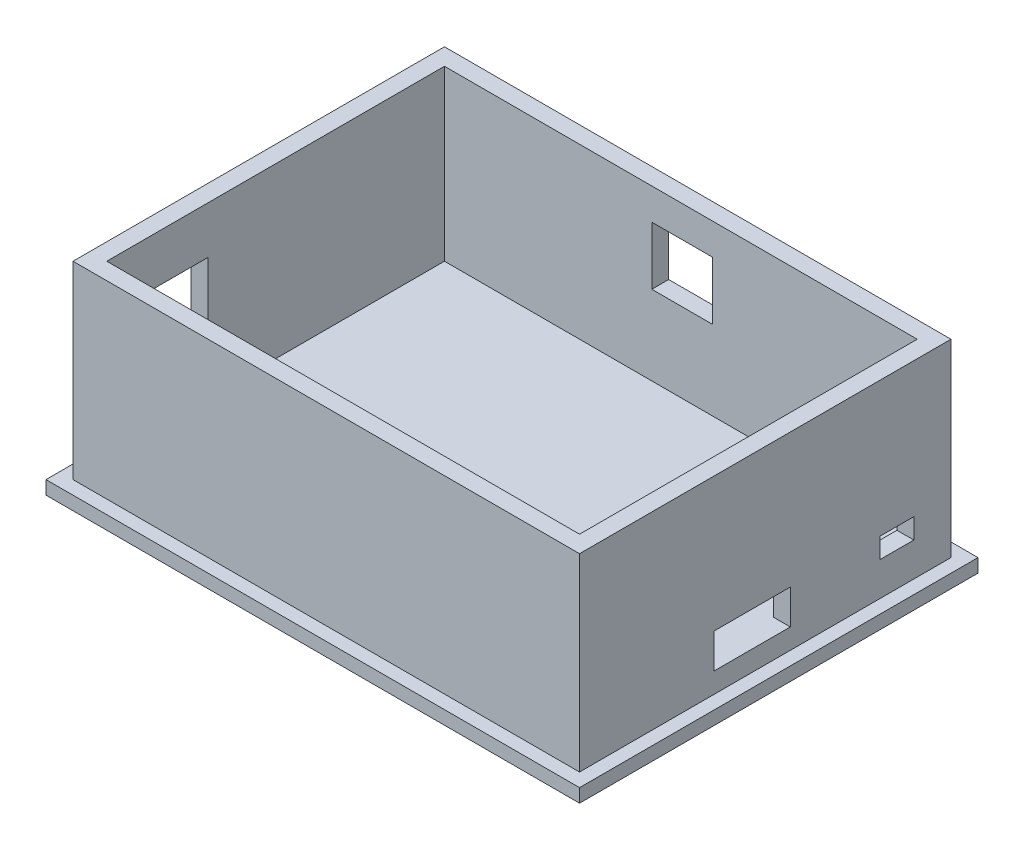
ISO-10303-21;
HEADER;
FILE_DESCRIPTION(('STEP AP214'),'2;1');
FILE_NAME('part.step','',(''),(''),'','','');
FILE_SCHEMA(('AUTOMOTIVE_DESIGN { 1 0 10303 214 1 1 1 1 }'));
ENDSEC;
DATA;
#1=APPLICATION_CONTEXT('core data for automotive mechanical design processes');
#2=APPLICATION_PROTOCOL_DEFINITION('international standard','automotive_design',2000,#1);
#3=PRODUCT_CONTEXT('',#1,'mechanical');
#4=PRODUCT('Part','Part','',(#3));
#5=PRODUCT_RELATED_PRODUCT_CATEGORY('part','',(#4));
#6=PRODUCT_DEFINITION_FORMATION('','',#4);
#7=PRODUCT_DEFINITION_CONTEXT('part definition',#1,'design');
#8=PRODUCT_DEFINITION('design','',#6,#7);
#9=PRODUCT_DEFINITION_SHAPE('','',#8);
#10=(LENGTH_UNIT() NAMED_UNIT(*) SI_UNIT(.MILLI.,.METRE.));
#11=(NAMED_UNIT(*) PLANE_ANGLE_UNIT() SI_UNIT($,.RADIAN.));
#12=(NAMED_UNIT(*) SI_UNIT($,.STERADIAN.) SOLID_ANGLE_UNIT());
#13=UNCERTAINTY_MEASURE_WITH_UNIT(LENGTH_MEASURE(1.E-05),#10,'distance_accuracy_value','');
#14=(GEOMETRIC_REPRESENTATION_CONTEXT(3) GLOBAL_UNCERTAINTY_ASSIGNED_CONTEXT((#13)) GLOBAL_UNIT_ASSIGNED_CONTEXT((#10,
#11,#12)) REPRESENTATION_CONTEXT('',''));
#15=CARTESIAN_POINT('',(0.,0.,0.));
#16=DIRECTION('',(0.,0.,1.));
#17=DIRECTION('',(1.,0.,0.));
#18=AXIS2_PLACEMENT_3D('',#15,#16,#17);
#19=CARTESIAN_POINT('',(0.,38.1,0.));
#20=DIRECTION('',(1.,0.,0.));
#21=DIRECTION('',(0.,0.,-1.));
#22=AXIS2_PLACEMENT_3D('',#19,#20,#21);
#23=PLANE('',#22);
#24=DIRECTION('',(0.,0.,-1.));
#25=VECTOR('',#24,1.);
#26=CARTESIAN_POINT('',(0.,19.05,-6.985));
#27=LINE('',#26,#25);
#28=CARTESIAN_POINT('',(0.,19.05,-6.985));
#29=VERTEX_POINT('',#28);
#30=CARTESIAN_POINT('',(0.,19.05,-22.225));
#31=VERTEX_POINT('',#30);
#32=EDGE_CURVE('E320',#29,#31,#27,.T.);
#33=ORIENTED_EDGE('',*,*,#32,.T.);
#34=DIRECTION('',(0.,-1.,0.));
#35=VECTOR('',#34,1.);
#36=CARTESIAN_POINT('',(0.,29.21,-22.225));
#37=LINE('',#36,#35);
#38=CARTESIAN_POINT('',(0.,29.21,-22.225));
#39=VERTEX_POINT('',#38);
#40=EDGE_CURVE('E325',#39,#31,#37,.T.);
#41=ORIENTED_EDGE('',*,*,#40,.F.);
#42=DIRECTION('',(0.,0.,-1.));
#43=VECTOR('',#42,1.);
#44=CARTESIAN_POINT('',(0.,29.21,-6.985));
#45=LINE('',#44,#43);
#46=CARTESIAN_POINT('',(0.,29.21,-6.985));
#47=VERTEX_POINT('',#46);
#48=EDGE_CURVE('E329',#47,#39,#45,.T.);
#49=ORIENTED_EDGE('',*,*,#48,.F.);
#50=DIRECTION('',(0.,-1.,0.));
#51=VECTOR('',#50,1.);
#52=CARTESIAN_POINT('',(0.,29.21,-6.985));
#53=LINE('',#52,#51);
#54=EDGE_CURVE('E315',#47,#29,#53,.T.);
#55=ORIENTED_EDGE('',*,*,#54,.T.);
#56=EDGE_LOOP('',(#33,#41,#49,#55));
#57=FACE_BOUND('',#56,.T.);
#58=DIRECTION('',(0.,0.,-1.));
#59=VECTOR('',#58,1.);
#60=CARTESIAN_POINT('',(0.,2.54,0.));
#61=LINE('',#60,#59);
#62=CARTESIAN_POINT('',(0.,2.54000000000001,0.));
#63=VERTEX_POINT('',#62);
#64=CARTESIAN_POINT('',(0.,2.54000000000001,-69.85));
#65=VERTEX_POINT('',#64);
#66=EDGE_CURVE('E309',#63,#65,#61,.T.);
#67=ORIENTED_EDGE('',*,*,#66,.F.);
#68=DIRECTION('',(0.,-1.,0.));
#69=VECTOR('',#68,1.);
#70=CARTESIAN_POINT('',(0.,38.1,0.));
#71=LINE('',#70,#69);
#72=CARTESIAN_POINT('',(0.,38.1,0.));
#73=VERTEX_POINT('',#72);
#74=EDGE_CURVE('E425',#73,#63,#71,.T.);
#75=ORIENTED_EDGE('',*,*,#74,.F.);
#76=DIRECTION('',(0.,0.,1.));
#77=VECTOR('',#76,1.);
#78=CARTESIAN_POINT('',(0.,38.1,0.));
#79=LINE('',#78,#77);
#80=CARTESIAN_POINT('',(0.,38.1,-69.85));
#81=VERTEX_POINT('',#80);
#82=EDGE_CURVE('E408',#81,#73,#79,.T.);
#83=ORIENTED_EDGE('',*,*,#82,.F.);
#84=DIRECTION('',(0.,-1.,0.));
#85=VECTOR('',#84,1.);
#86=CARTESIAN_POINT('',(0.,38.1,-69.85));
#87=LINE('',#86,#85);
#88=EDGE_CURVE('E417',#81,#65,#87,.T.);
#89=ORIENTED_EDGE('',*,*,#88,.T.);
#90=EDGE_LOOP('',(#67,#75,#83,#89));
#91=FACE_BOUND('',#90,.T.);
#92=ADVANCED_FACE('F39',(#57,#91),#23,.F.);
#93=CARTESIAN_POINT('',(0.,38.1,0.));
#94=DIRECTION('',(0.,0.,-1.));
#95=DIRECTION('',(-1.,0.,0.));
#96=AXIS2_PLACEMENT_3D('',#93,#94,#95);
#97=PLANE('',#96);
#98=DIRECTION('',(-1.,0.,0.));
#99=VECTOR('',#98,1.);
#100=CARTESIAN_POINT('',(0.,2.54,0.));
#101=LINE('',#100,#99);
#102=CARTESIAN_POINT('',(95.25,2.54000000000001,0.));
#103=VERTEX_POINT('',#102);
#104=EDGE_CURVE('E306',#103,#63,#101,.T.);
#105=ORIENTED_EDGE('',*,*,#104,.F.);
#106=DIRECTION('',(0.,-1.,0.));
#107=VECTOR('',#106,1.);
#108=CARTESIAN_POINT('',(95.25,38.1,0.));
#109=LINE('',#108,#107);
#110=CARTESIAN_POINT('',(95.25,38.1,0.));
#111=VERTEX_POINT('',#110);
#112=EDGE_CURVE('E422',#111,#103,#109,.T.);
#113=ORIENTED_EDGE('',*,*,#112,.F.);
#114=DIRECTION('',(1.,0.,0.));
#115=VECTOR('',#114,1.);
#116=CARTESIAN_POINT('',(0.,38.1,0.));
#117=LINE('',#116,#115);
#118=EDGE_CURVE('E411',#73,#111,#117,.T.);
#119=ORIENTED_EDGE('',*,*,#118,.F.);
#120=ORIENTED_EDGE('',*,*,#74,.T.);
#121=EDGE_LOOP('',(#105,#113,#119,#120));
#122=FACE_BOUND('',#121,.T.);
#123=ADVANCED_FACE('F464',(#122),#97,.F.);
#124=CARTESIAN_POINT('',(95.25,38.1,0.));
#125=DIRECTION('',(-1.,0.,0.));
#126=DIRECTION('',(0.,0.,1.));
#127=AXIS2_PLACEMENT_3D('',#124,#125,#126);
#128=PLANE('',#127);
#129=DIRECTION('',(0.,0.,-1.));
#130=VECTOR('',#129,1.);
#131=CARTESIAN_POINT('',(95.25,6.34999999999999,-25.2733371314221));
#132=LINE('',#131,#130);
#133=CARTESIAN_POINT('',(95.25,6.34999999999999,-25.2733371314221));
#134=VERTEX_POINT('',#133);
#135=CARTESIAN_POINT('',(95.25,6.34999999999999,-39.6356044285321));
#136=VERTEX_POINT('',#135);
#137=EDGE_CURVE('E234',#134,#136,#132,.T.);
#138=ORIENTED_EDGE('',*,*,#137,.F.);
#139=DIRECTION('',(0.,-1.,0.));
#140=VECTOR('',#139,1.);
#141=CARTESIAN_POINT('',(95.25,12.8518040795691,-25.2733371314221));
#142=LINE('',#141,#140);
#143=CARTESIAN_POINT('',(95.25,12.8518040795691,-25.2733371314221));
#144=VERTEX_POINT('',#143);
#145=EDGE_CURVE('E53',#144,#134,#142,.T.);
#146=ORIENTED_EDGE('',*,*,#145,.F.);
#147=DIRECTION('',(0.,0.,1.));
#148=VECTOR('',#147,1.);
#149=CARTESIAN_POINT('',(95.25,12.8518040795691,-25.2733371314221));
#150=LINE('',#149,#148);
#151=CARTESIAN_POINT('',(95.25,12.8518040795691,-39.6356044285321));
#152=VERTEX_POINT('',#151);
#153=EDGE_CURVE('E242',#152,#144,#150,.T.);
#154=ORIENTED_EDGE('',*,*,#153,.F.);
#155=DIRECTION('',(0.,1.,0.));
#156=VECTOR('',#155,1.);
#157=CARTESIAN_POINT('',(95.25,12.8518040795691,-39.6356044285321));
#158=LINE('',#157,#156);
#159=EDGE_CURVE('E225',#136,#152,#158,.T.);
#160=ORIENTED_EDGE('',*,*,#159,.F.);
#161=EDGE_LOOP('',(#138,#146,#154,#160));
#162=FACE_BOUND('',#161,.T.);
#163=DIRECTION('',(0.,-1.,0.));
#164=VECTOR('',#163,1.);
#165=CARTESIAN_POINT('',(95.25,12.7,-56.515));
#166=LINE('',#165,#164);
#167=CARTESIAN_POINT('',(95.25,12.7,-56.515));
#168=VERTEX_POINT('',#167);
#169=CARTESIAN_POINT('',(95.25,8.89,-56.515));
#170=VERTEX_POINT('',#169);
#171=EDGE_CURVE('E355',#168,#170,#166,.T.);
#172=ORIENTED_EDGE('',*,*,#171,.F.);
#173=DIRECTION('',(0.,0.,1.));
#174=VECTOR('',#173,1.);
#175=CARTESIAN_POINT('',(95.25,12.7,-62.865));
#176=LINE('',#175,#174);
#177=CARTESIAN_POINT('',(95.25,12.7,-62.865));
#178=VERTEX_POINT('',#177);
#179=EDGE_CURVE('E353',#178,#168,#176,.T.);
#180=ORIENTED_EDGE('',*,*,#179,.F.);
#181=DIRECTION('',(0.,-1.,0.));
#182=VECTOR('',#181,1.);
#183=CARTESIAN_POINT('',(95.25,12.7,-62.865));
#184=LINE('',#183,#182);
#185=CARTESIAN_POINT('',(95.25,8.89,-62.865));
#186=VERTEX_POINT('',#185);
#187=EDGE_CURVE('E361',#178,#186,#184,.T.);
#188=ORIENTED_EDGE('',*,*,#187,.T.);
#189=DIRECTION('',(0.,0.,1.));
#190=VECTOR('',#189,1.);
#191=CARTESIAN_POINT('',(95.25,8.89,-62.865));
#192=LINE('',#191,#190);
#193=EDGE_CURVE('E358',#186,#170,#192,.T.);
#194=ORIENTED_EDGE('',*,*,#193,.T.);
#195=EDGE_LOOP('',(#172,#180,#188,#194));
#196=FACE_BOUND('',#195,.T.);
#197=DIRECTION('',(0.,0.,1.));
#198=VECTOR('',#197,1.);
#199=CARTESIAN_POINT('',(95.25,2.54,0.));
#200=LINE('',#199,#198);
#201=CARTESIAN_POINT('',(95.25,2.54,-69.85));
#202=VERTEX_POINT('',#201);
#203=EDGE_CURVE('E298',#202,#103,#200,.T.);
#204=ORIENTED_EDGE('',*,*,#203,.F.);
#205=DIRECTION('',(0.,-1.,0.));
#206=VECTOR('',#205,1.);
#207=CARTESIAN_POINT('',(95.25,38.1,-69.85));
#208=LINE('',#207,#206);
#209=CARTESIAN_POINT('',(95.25,38.1,-69.85));
#210=VERTEX_POINT('',#209);
#211=EDGE_CURVE('E420',#210,#202,#208,.T.);
#212=ORIENTED_EDGE('',*,*,#211,.F.);
#213=DIRECTION('',(0.,0.,-1.));
#214=VECTOR('',#213,1.);
#215=CARTESIAN_POINT('',(95.25,38.1,0.));
#216=LINE('',#215,#214);
#217=EDGE_CURVE('E413',#111,#210,#216,.T.);
#218=ORIENTED_EDGE('',*,*,#217,.F.);
#219=ORIENTED_EDGE('',*,*,#112,.T.);
#220=EDGE_LOOP('',(#204,#212,#218,#219));
#221=FACE_BOUND('',#220,.T.);
#222=ADVANCED_FACE('F239',(#162,#196,#221),#128,.F.);
#223=CARTESIAN_POINT('',(0.,38.1,-69.85));
#224=DIRECTION('',(0.,0.,1.));
#225=DIRECTION('',(1.,0.,0.));
#226=AXIS2_PLACEMENT_3D('',#223,#224,#225);
#227=PLANE('',#226);
#228=DIRECTION('',(-1.,0.,0.));
#229=VECTOR('',#228,1.);
#230=CARTESIAN_POINT('',(53.594,21.2782516939242,-69.85));
#231=LINE('',#230,#229);
#232=CARTESIAN_POINT('',(53.594,21.2782516939242,-69.85));
#233=VERTEX_POINT('',#232);
#234=CARTESIAN_POINT('',(42.164,21.2782516939242,-69.85));
#235=VERTEX_POINT('',#234);
#236=EDGE_CURVE('E253',#233,#235,#231,.T.);
#237=ORIENTED_EDGE('',*,*,#236,.F.);
#238=DIRECTION('',(0.,-1.,0.));
#239=VECTOR('',#238,1.);
#240=CARTESIAN_POINT('',(53.594,32.2077929567366,-69.85));
#241=LINE('',#240,#239);
#242=CARTESIAN_POINT('',(53.594,32.2077929567366,-69.85));
#243=VERTEX_POINT('',#242);
#244=EDGE_CURVE('E249',#243,#233,#241,.T.);
#245=ORIENTED_EDGE('',*,*,#244,.F.);
#246=DIRECTION('',(1.,0.,0.));
#247=VECTOR('',#246,1.);
#248=CARTESIAN_POINT('',(53.594,32.2077929567366,-69.85));
#249=LINE('',#248,#247);
#250=CARTESIAN_POINT('',(42.164,32.2077929567366,-69.85));
#251=VERTEX_POINT('',#250);
#252=EDGE_CURVE('E259',#251,#243,#249,.T.);
#253=ORIENTED_EDGE('',*,*,#252,.F.);
#254=DIRECTION('',(0.,1.,0.));
#255=VECTOR('',#254,1.);
#256=CARTESIAN_POINT('',(42.164,32.2077929567366,-69.85));
#257=LINE('',#256,#255);
#258=EDGE_CURVE('E256',#235,#251,#257,.T.);
#259=ORIENTED_EDGE('',*,*,#258,.F.);
#260=EDGE_LOOP('',(#237,#245,#253,#259));
#261=FACE_BOUND('',#260,.T.);
#262=DIRECTION('',(1.,0.,0.));
#263=VECTOR('',#262,1.);
#264=CARTESIAN_POINT('',(0.,2.54,-69.85));
#265=LINE('',#264,#263);
#266=EDGE_CURVE('E428',#65,#202,#265,.T.);
#267=ORIENTED_EDGE('',*,*,#266,.F.);
#268=ORIENTED_EDGE('',*,*,#88,.F.);
#269=DIRECTION('',(-1.,0.,0.));
#270=VECTOR('',#269,1.);
#271=CARTESIAN_POINT('',(0.,38.1,-69.85));
#272=LINE('',#271,#270);
#273=EDGE_CURVE('E415',#210,#81,#272,.T.);
#274=ORIENTED_EDGE('',*,*,#273,.F.);
#275=ORIENTED_EDGE('',*,*,#211,.T.);
#276=EDGE_LOOP('',(#267,#268,#274,#275));
#277=FACE_BOUND('',#276,.T.);
#278=ADVANCED_FACE('F487',(#261,#277),#227,.F.);
#279=CARTESIAN_POINT('',(0.,38.1,0.));
#280=DIRECTION('',(0.,-1.,0.));
#281=DIRECTION('',(0.,0.,-1.));
#282=AXIS2_PLACEMENT_3D('',#279,#280,#281);
#283=PLANE('',#282);
#284=DIRECTION('',(0.,0.,-1.));
#285=VECTOR('',#284,1.);
#286=CARTESIAN_POINT('',(92.075,38.1,-66.675));
#287=LINE('',#286,#285);
#288=CARTESIAN_POINT('',(92.075,38.1,-3.17500000000001));
#289=VERTEX_POINT('',#288);
#290=CARTESIAN_POINT('',(92.075,38.1,-66.675));
#291=VERTEX_POINT('',#290);
#292=EDGE_CURVE('E380',#289,#291,#287,.T.);
#293=ORIENTED_EDGE('',*,*,#292,.F.);
#294=DIRECTION('',(1.,0.,0.));
#295=VECTOR('',#294,1.);
#296=CARTESIAN_POINT('',(3.175,38.1,-3.175));
#297=LINE('',#296,#295);
#298=CARTESIAN_POINT('',(3.175,38.1,-3.175));
#299=VERTEX_POINT('',#298);
#300=EDGE_CURVE('E383',#299,#289,#297,.T.);
#301=ORIENTED_EDGE('',*,*,#300,.F.);
#302=DIRECTION('',(0.,0.,1.));
#303=VECTOR('',#302,1.);
#304=CARTESIAN_POINT('',(3.175,38.1,-66.675));
#305=LINE('',#304,#303);
#306=CARTESIAN_POINT('',(3.175,38.1,-66.675));
#307=VERTEX_POINT('',#306);
#308=EDGE_CURVE('E376',#307,#299,#305,.T.);
#309=ORIENTED_EDGE('',*,*,#308,.F.);
#310=DIRECTION('',(-1.,0.,0.));
#311=VECTOR('',#310,1.);
#312=CARTESIAN_POINT('',(3.175,38.1,-66.675));
#313=LINE('',#312,#311);
#314=EDGE_CURVE('E377',#291,#307,#313,.T.);
#315=ORIENTED_EDGE('',*,*,#314,.F.);
#316=EDGE_LOOP('',(#293,#301,#309,#315));
#317=FACE_BOUND('',#316,.T.);
#318=ORIENTED_EDGE('',*,*,#82,.T.);
#319=ORIENTED_EDGE('',*,*,#118,.T.);
#320=ORIENTED_EDGE('',*,*,#217,.T.);
#321=ORIENTED_EDGE('',*,*,#273,.T.);
#322=EDGE_LOOP('',(#318,#319,#320,#321));
#323=FACE_BOUND('',#322,.T.);
#324=ADVANCED_FACE('F485',(#317,#323),#283,.F.);
#325=CARTESIAN_POINT('',(0.,6.35,0.));
#326=DIRECTION('',(0.,-1.,0.));
#327=DIRECTION('',(0.,0.,-1.));
#328=AXIS2_PLACEMENT_3D('',#325,#326,#327);
#329=PLANE('',#328);
#330=DIRECTION('',(1.,0.,0.));
#331=VECTOR('',#330,1.);
#332=CARTESIAN_POINT('',(88.9,6.34999999999999,-39.6356044285321));
#333=LINE('',#332,#331);
#334=CARTESIAN_POINT('',(92.075,6.34999999999999,-39.6356044285321));
#335=VERTEX_POINT('',#334);
#336=EDGE_CURVE('E61',#335,#136,#333,.T.);
#337=ORIENTED_EDGE('',*,*,#336,.F.);
#338=DIRECTION('',(0.,0.,-1.));
#339=VECTOR('',#338,1.);
#340=CARTESIAN_POINT('',(92.075,6.34999999999999,-66.675));
#341=LINE('',#340,#339);
#342=CARTESIAN_POINT('',(92.075,6.34999999999999,-66.675));
#343=VERTEX_POINT('',#342);
#344=EDGE_CURVE('E402',#335,#343,#341,.T.);
#345=ORIENTED_EDGE('',*,*,#344,.T.);
#346=DIRECTION('',(-1.,0.,0.));
#347=VECTOR('',#346,1.);
#348=CARTESIAN_POINT('',(3.175,6.34999999999999,-66.675));
#349=LINE('',#348,#347);
#350=CARTESIAN_POINT('',(3.175,6.34999999999999,-66.675));
#351=VERTEX_POINT('',#350);
#352=EDGE_CURVE('E396',#343,#351,#349,.T.);
#353=ORIENTED_EDGE('',*,*,#352,.T.);
#354=DIRECTION('',(0.,0.,1.));
#355=VECTOR('',#354,1.);
#356=CARTESIAN_POINT('',(3.175,6.34999999999999,-66.675));
#357=LINE('',#356,#355);
#358=CARTESIAN_POINT('',(3.175,6.34999999999999,-3.175));
#359=VERTEX_POINT('',#358);
#360=EDGE_CURVE('E391',#351,#359,#357,.T.);
#361=ORIENTED_EDGE('',*,*,#360,.T.);
#362=DIRECTION('',(1.,0.,0.));
#363=VECTOR('',#362,1.);
#364=CARTESIAN_POINT('',(3.175,6.34999999999999,-3.175));
#365=LINE('',#364,#363);
#366=CARTESIAN_POINT('',(92.075,6.34999999999999,-3.17500000000001));
#367=VERTEX_POINT('',#366);
#368=EDGE_CURVE('E379',#359,#367,#365,.T.);
#369=ORIENTED_EDGE('',*,*,#368,.T.);
#370=CARTESIAN_POINT('',(92.075,6.34999999999999,-25.2733371314221));
#371=VERTEX_POINT('',#370);
#372=EDGE_CURVE('E400',#367,#371,#341,.T.);
#373=ORIENTED_EDGE('',*,*,#372,.T.);
#374=DIRECTION('',(1.,0.,0.));
#375=VECTOR('',#374,1.);
#376=CARTESIAN_POINT('',(88.9,6.34999999999999,-25.2733371314221));
#377=LINE('',#376,#375);
#378=EDGE_CURVE('E231',#371,#134,#377,.T.);
#379=ORIENTED_EDGE('',*,*,#378,.T.);
#380=ORIENTED_EDGE('',*,*,#137,.T.);
#381=EDGE_LOOP('',(#337,#345,#353,#361,#369,#373,#379,#380));
#382=FACE_BOUND('',#381,.T.);
#383=ADVANCED_FACE('F235',(#382),#329,.F.);
#384=CARTESIAN_POINT('',(3.175,-109.249530891441,-3.175));
#385=DIRECTION('',(0.,0.,1.));
#386=DIRECTION('',(1.,0.,0.));
#387=AXIS2_PLACEMENT_3D('',#384,#385,#386);
#388=PLANE('',#387);
#389=DIRECTION('',(0.,1.,0.));
#390=VECTOR('',#389,1.);
#391=CARTESIAN_POINT('',(3.175,-109.249530891441,-3.175));
#392=LINE('',#391,#390);
#393=EDGE_CURVE('E394',#359,#299,#392,.T.);
#394=ORIENTED_EDGE('',*,*,#393,.T.);
#395=ORIENTED_EDGE('',*,*,#300,.T.);
#396=DIRECTION('',(0.,1.,0.));
#397=VECTOR('',#396,1.);
#398=CARTESIAN_POINT('',(92.075,-109.249530891441,-3.17500000000001));
#399=LINE('',#398,#397);
#400=EDGE_CURVE('E390',#367,#289,#399,.T.);
#401=ORIENTED_EDGE('',*,*,#400,.F.);
#402=ORIENTED_EDGE('',*,*,#368,.F.);
#403=EDGE_LOOP('',(#394,#395,#401,#402));
#404=FACE_BOUND('',#403,.T.);
#405=ADVANCED_FACE('F508',(#404),#388,.F.);
#406=CARTESIAN_POINT('',(92.075,-109.249530891441,-66.675));
#407=DIRECTION('',(1.,0.,0.));
#408=DIRECTION('',(0.,0.,-1.));
#409=AXIS2_PLACEMENT_3D('',#406,#407,#408);
#410=PLANE('',#409);
#411=DIRECTION('',(0.,1.,0.));
#412=VECTOR('',#411,1.);
#413=CARTESIAN_POINT('',(92.075,12.7,-62.865));
#414=LINE('',#413,#412);
#415=CARTESIAN_POINT('',(92.075,8.89,-62.865));
#416=VERTEX_POINT('',#415);
#417=CARTESIAN_POINT('',(92.075,12.7,-62.865));
#418=VERTEX_POINT('',#417);
#419=EDGE_CURVE('E347',#416,#418,#414,.T.);
#420=ORIENTED_EDGE('',*,*,#419,.T.);
#421=DIRECTION('',(0.,0.,-1.));
#422=VECTOR('',#421,1.);
#423=CARTESIAN_POINT('',(92.075,12.7,-62.865));
#424=LINE('',#423,#422);
#425=CARTESIAN_POINT('',(92.075,12.7,-56.515));
#426=VERTEX_POINT('',#425);
#427=EDGE_CURVE('E350',#426,#418,#424,.T.);
#428=ORIENTED_EDGE('',*,*,#427,.F.);
#429=DIRECTION('',(0.,1.,0.));
#430=VECTOR('',#429,1.);
#431=CARTESIAN_POINT('',(92.075,12.7,-56.515));
#432=LINE('',#431,#430);
#433=CARTESIAN_POINT('',(92.075,8.89,-56.515));
#434=VERTEX_POINT('',#433);
#435=EDGE_CURVE('E367',#434,#426,#432,.T.);
#436=ORIENTED_EDGE('',*,*,#435,.F.);
#437=DIRECTION('',(0.,0.,-1.));
#438=VECTOR('',#437,1.);
#439=CARTESIAN_POINT('',(92.075,8.89,-62.865));
#440=LINE('',#439,#438);
#441=EDGE_CURVE('E344',#434,#416,#440,.T.);
#442=ORIENTED_EDGE('',*,*,#441,.T.);
#443=EDGE_LOOP('',(#420,#428,#436,#442));
#444=FACE_BOUND('',#443,.T.);
#445=DIRECTION('',(0.,0.,1.));
#446=VECTOR('',#445,1.);
#447=CARTESIAN_POINT('',(92.075,12.8518040795691,-66.675));
#448=LINE('',#447,#446);
#449=CARTESIAN_POINT('',(92.075,12.8518040795691,-39.6356044285321));
#450=VERTEX_POINT('',#449);
#451=CARTESIAN_POINT('',(92.075,12.8518040795691,-25.2733371314221));
#452=VERTEX_POINT('',#451);
#453=EDGE_CURVE('E46',#450,#452,#448,.T.);
#454=ORIENTED_EDGE('',*,*,#453,.T.);
#455=DIRECTION('',(0.,-1.,0.));
#456=VECTOR('',#455,1.);
#457=CARTESIAN_POINT('',(92.075,-109.249530891441,-25.2733371314221));
#458=LINE('',#457,#456);
#459=EDGE_CURVE('E12',#452,#371,#458,.T.);
#460=ORIENTED_EDGE('',*,*,#459,.T.);
#461=ORIENTED_EDGE('',*,*,#372,.F.);
#462=ORIENTED_EDGE('',*,*,#400,.T.);
#463=ORIENTED_EDGE('',*,*,#292,.T.);
#464=DIRECTION('',(0.,1.,0.));
#465=VECTOR('',#464,1.);
#466=CARTESIAN_POINT('',(92.075,-109.249530891441,-66.675));
#467=LINE('',#466,#465);
#468=EDGE_CURVE('E399',#343,#291,#467,.T.);
#469=ORIENTED_EDGE('',*,*,#468,.F.);
#470=ORIENTED_EDGE('',*,*,#344,.F.);
#471=DIRECTION('',(0.,1.,0.));
#472=VECTOR('',#471,1.);
#473=CARTESIAN_POINT('',(92.075,-109.249530891441,-39.6356044285321));
#474=LINE('',#473,#472);
#475=EDGE_CURVE('E228',#335,#450,#474,.T.);
#476=ORIENTED_EDGE('',*,*,#475,.T.);
#477=EDGE_LOOP('',(#454,#460,#461,#462,#463,#469,#470,#476));
#478=FACE_BOUND('',#477,.T.);
#479=ADVANCED_FACE('F445',(#444,#478),#410,.F.);
#480=CARTESIAN_POINT('',(3.175,-109.249530891441,-66.675));
#481=DIRECTION('',(0.,0.,-1.));
#482=DIRECTION('',(-1.,0.,0.));
#483=AXIS2_PLACEMENT_3D('',#480,#481,#482);
#484=PLANE('',#483);
#485=DIRECTION('',(1.,0.,0.));
#486=VECTOR('',#485,1.);
#487=CARTESIAN_POINT('',(3.17499999999991,32.2077929567366,-66.675));
#488=LINE('',#487,#486);
#489=CARTESIAN_POINT('',(42.164,32.2077929567366,-66.675));
#490=VERTEX_POINT('',#489);
#491=CARTESIAN_POINT('',(53.594,32.2077929567366,-66.675));
#492=VERTEX_POINT('',#491);
#493=EDGE_CURVE('E437',#490,#492,#488,.T.);
#494=ORIENTED_EDGE('',*,*,#493,.T.);
#495=DIRECTION('',(0.,-1.,0.));
#496=VECTOR('',#495,1.);
#497=CARTESIAN_POINT('',(53.594,-109.249530891441,-66.675));
#498=LINE('',#497,#496);
#499=CARTESIAN_POINT('',(53.594,21.2782516939242,-66.675));
#500=VERTEX_POINT('',#499);
#501=EDGE_CURVE('E440',#492,#500,#498,.T.);
#502=ORIENTED_EDGE('',*,*,#501,.T.);
#503=DIRECTION('',(-1.,0.,0.));
#504=VECTOR('',#503,1.);
#505=CARTESIAN_POINT('',(3.175,21.2782516939242,-66.675));
#506=LINE('',#505,#504);
#507=CARTESIAN_POINT('',(42.164,21.2782516939242,-66.675));
#508=VERTEX_POINT('',#507);
#509=EDGE_CURVE('E431',#500,#508,#506,.T.);
#510=ORIENTED_EDGE('',*,*,#509,.T.);
#511=DIRECTION('',(0.,1.,0.));
#512=VECTOR('',#511,1.);
#513=CARTESIAN_POINT('',(42.164,-109.249530891441,-66.675));
#514=LINE('',#513,#512);
#515=EDGE_CURVE('E434',#508,#490,#514,.T.);
#516=ORIENTED_EDGE('',*,*,#515,.T.);
#517=EDGE_LOOP('',(#494,#502,#510,#516));
#518=FACE_BOUND('',#517,.T.);
#519=ORIENTED_EDGE('',*,*,#468,.T.);
#520=ORIENTED_EDGE('',*,*,#314,.T.);
#521=DIRECTION('',(0.,1.,0.));
#522=VECTOR('',#521,1.);
#523=CARTESIAN_POINT('',(3.175,-109.249530891441,-66.675));
#524=LINE('',#523,#522);
#525=EDGE_CURVE('E395',#351,#307,#524,.T.);
#526=ORIENTED_EDGE('',*,*,#525,.F.);
#527=ORIENTED_EDGE('',*,*,#352,.F.);
#528=EDGE_LOOP('',(#519,#520,#526,#527));
#529=FACE_BOUND('',#528,.T.);
#530=ADVANCED_FACE('F514',(#518,#529),#484,.F.);
#531=CARTESIAN_POINT('',(3.175,-109.249530891441,-66.675));
#532=DIRECTION('',(-1.,0.,0.));
#533=DIRECTION('',(0.,0.,1.));
#534=AXIS2_PLACEMENT_3D('',#531,#532,#533);
#535=PLANE('',#534);
#536=DIRECTION('',(0.,0.,1.));
#537=VECTOR('',#536,1.);
#538=CARTESIAN_POINT('',(3.175,29.21,-6.985));
#539=LINE('',#538,#537);
#540=CARTESIAN_POINT('',(3.175,29.21,-22.225));
#541=VERTEX_POINT('',#540);
#542=CARTESIAN_POINT('',(3.175,29.21,-6.985));
#543=VERTEX_POINT('',#542);
#544=EDGE_CURVE('E314',#541,#543,#539,.T.);
#545=ORIENTED_EDGE('',*,*,#544,.F.);
#546=DIRECTION('',(0.,1.,0.));
#547=VECTOR('',#546,1.);
#548=CARTESIAN_POINT('',(3.175,29.21,-22.225));
#549=LINE('',#548,#547);
#550=CARTESIAN_POINT('',(3.175,19.05,-22.225));
#551=VERTEX_POINT('',#550);
#552=EDGE_CURVE('E312',#551,#541,#549,.T.);
#553=ORIENTED_EDGE('',*,*,#552,.F.);
#554=DIRECTION('',(0.,0.,1.));
#555=VECTOR('',#554,1.);
#556=CARTESIAN_POINT('',(3.175,19.05,-6.985));
#557=LINE('',#556,#555);
#558=CARTESIAN_POINT('',(3.175,19.05,-6.985));
#559=VERTEX_POINT('',#558);
#560=EDGE_CURVE('E336',#551,#559,#557,.T.);
#561=ORIENTED_EDGE('',*,*,#560,.T.);
#562=DIRECTION('',(0.,1.,0.));
#563=VECTOR('',#562,1.);
#564=CARTESIAN_POINT('',(3.175,29.21,-6.985));
#565=LINE('',#564,#563);
#566=EDGE_CURVE('E323',#559,#543,#565,.T.);
#567=ORIENTED_EDGE('',*,*,#566,.T.);
#568=EDGE_LOOP('',(#545,#553,#561,#567));
#569=FACE_BOUND('',#568,.T.);
#570=ORIENTED_EDGE('',*,*,#525,.T.);
#571=ORIENTED_EDGE('',*,*,#308,.T.);
#572=ORIENTED_EDGE('',*,*,#393,.F.);
#573=ORIENTED_EDGE('',*,*,#360,.F.);
#574=EDGE_LOOP('',(#570,#571,#572,#573));
#575=FACE_BOUND('',#574,.T.);
#576=ADVANCED_FACE('F518',(#569,#575),#535,.F.);
#577=CARTESIAN_POINT('',(-0.001000000000001,12.7,-62.865));
#578=DIRECTION('',(0.,1.,0.));
#579=DIRECTION('',(0.,0.,1.));
#580=AXIS2_PLACEMENT_3D('',#577,#578,#579);
#581=PLANE('',#580);
#582=ORIENTED_EDGE('',*,*,#427,.T.);
#583=DIRECTION('',(1.,0.,0.));
#584=VECTOR('',#583,1.);
#585=CARTESIAN_POINT('',(-0.001000000000001,12.7,-62.865));
#586=LINE('',#585,#584);
#587=EDGE_CURVE('E365',#418,#178,#586,.T.);
#588=ORIENTED_EDGE('',*,*,#587,.T.);
#589=ORIENTED_EDGE('',*,*,#179,.T.);
#590=DIRECTION('',(1.,0.,0.));
#591=VECTOR('',#590,1.);
#592=CARTESIAN_POINT('',(-0.001000000000001,12.7,-56.515));
#593=LINE('',#592,#591);
#594=EDGE_CURVE('E364',#426,#168,#593,.T.);
#595=ORIENTED_EDGE('',*,*,#594,.F.);
#596=EDGE_LOOP('',(#582,#588,#589,#595));
#597=FACE_BOUND('',#596,.T.);
#598=ADVANCED_FACE('F522',(#597),#581,.F.);
#599=CARTESIAN_POINT('',(-0.001000000000001,12.7,-62.865));
#600=DIRECTION('',(0.,0.,1.));
#601=DIRECTION('',(1.,0.,0.));
#602=AXIS2_PLACEMENT_3D('',#599,#600,#601);
#603=PLANE('',#602);
#604=DIRECTION('',(1.,0.,0.));
#605=VECTOR('',#604,1.);
#606=CARTESIAN_POINT('',(-0.001000000000001,8.89,-62.865));
#607=LINE('',#606,#605);
#608=EDGE_CURVE('E368',#416,#186,#607,.T.);
#609=ORIENTED_EDGE('',*,*,#608,.T.);
#610=ORIENTED_EDGE('',*,*,#187,.F.);
#611=ORIENTED_EDGE('',*,*,#587,.F.);
#612=ORIENTED_EDGE('',*,*,#419,.F.);
#613=EDGE_LOOP('',(#609,#610,#611,#612));
#614=FACE_BOUND('',#613,.T.);
#615=ADVANCED_FACE('F526',(#614),#603,.T.);
#616=CARTESIAN_POINT('',(-0.001000000000001,8.89,-62.865));
#617=DIRECTION('',(0.,1.,0.));
#618=DIRECTION('',(0.,0.,1.));
#619=AXIS2_PLACEMENT_3D('',#616,#617,#618);
#620=PLANE('',#619);
#621=DIRECTION('',(1.,0.,0.));
#622=VECTOR('',#621,1.);
#623=CARTESIAN_POINT('',(-0.001000000000001,8.89,-56.515));
#624=LINE('',#623,#622);
#625=EDGE_CURVE('E370',#434,#170,#624,.T.);
#626=ORIENTED_EDGE('',*,*,#625,.T.);
#627=ORIENTED_EDGE('',*,*,#193,.F.);
#628=ORIENTED_EDGE('',*,*,#608,.F.);
#629=ORIENTED_EDGE('',*,*,#441,.F.);
#630=EDGE_LOOP('',(#626,#627,#628,#629));
#631=FACE_BOUND('',#630,.T.);
#632=ADVANCED_FACE('F532',(#631),#620,.T.);
#633=CARTESIAN_POINT('',(-0.001000000000001,12.7,-56.515));
#634=DIRECTION('',(0.,0.,1.));
#635=DIRECTION('',(1.,0.,0.));
#636=AXIS2_PLACEMENT_3D('',#633,#634,#635);
#637=PLANE('',#636);
#638=ORIENTED_EDGE('',*,*,#435,.T.);
#639=ORIENTED_EDGE('',*,*,#594,.T.);
#640=ORIENTED_EDGE('',*,*,#171,.T.);
#641=ORIENTED_EDGE('',*,*,#625,.F.);
#642=EDGE_LOOP('',(#638,#639,#640,#641));
#643=FACE_BOUND('',#642,.T.);
#644=ADVANCED_FACE('F528',(#643),#637,.F.);
#645=CARTESIAN_POINT('',(95.251,29.21,-22.225));
#646=DIRECTION('',(0.,0.,-1.));
#647=DIRECTION('',(-1.,0.,0.));
#648=AXIS2_PLACEMENT_3D('',#645,#646,#647);
#649=PLANE('',#648);
#650=ORIENTED_EDGE('',*,*,#552,.T.);
#651=DIRECTION('',(-1.,0.,0.));
#652=VECTOR('',#651,1.);
#653=CARTESIAN_POINT('',(95.251,29.21,-22.225));
#654=LINE('',#653,#652);
#655=EDGE_CURVE('E318',#541,#39,#654,.T.);
#656=ORIENTED_EDGE('',*,*,#655,.T.);
#657=ORIENTED_EDGE('',*,*,#40,.T.);
#658=DIRECTION('',(-1.,0.,0.));
#659=VECTOR('',#658,1.);
#660=CARTESIAN_POINT('',(95.251,19.05,-22.225));
#661=LINE('',#660,#659);
#662=EDGE_CURVE('E328',#551,#31,#661,.T.);
#663=ORIENTED_EDGE('',*,*,#662,.F.);
#664=EDGE_LOOP('',(#650,#656,#657,#663));
#665=FACE_BOUND('',#664,.T.);
#666=ADVANCED_FACE('F531',(#665),#649,.F.);
#667=CARTESIAN_POINT('',(95.251,19.05,-6.985));
#668=DIRECTION('',(0.,1.,0.));
#669=DIRECTION('',(0.,0.,1.));
#670=AXIS2_PLACEMENT_3D('',#667,#668,#669);
#671=PLANE('',#670);
#672=ORIENTED_EDGE('',*,*,#662,.T.);
#673=ORIENTED_EDGE('',*,*,#32,.F.);
#674=DIRECTION('',(-1.,0.,0.));
#675=VECTOR('',#674,1.);
#676=CARTESIAN_POINT('',(95.251,19.05,-6.985));
#677=LINE('',#676,#675);
#678=EDGE_CURVE('E324',#559,#29,#677,.T.);
#679=ORIENTED_EDGE('',*,*,#678,.F.);
#680=ORIENTED_EDGE('',*,*,#560,.F.);
#681=EDGE_LOOP('',(#672,#673,#679,#680));
#682=FACE_BOUND('',#681,.T.);
#683=ADVANCED_FACE('F542',(#682),#671,.T.);
#684=CARTESIAN_POINT('',(95.251,29.21,-6.985));
#685=DIRECTION('',(0.,0.,-1.));
#686=DIRECTION('',(0.,1.,0.));
#687=AXIS2_PLACEMENT_3D('',#684,#685,#686);
#688=PLANE('',#687);
#689=ORIENTED_EDGE('',*,*,#678,.T.);
#690=ORIENTED_EDGE('',*,*,#54,.F.);
#691=DIRECTION('',(-1.,0.,0.));
#692=VECTOR('',#691,1.);
#693=CARTESIAN_POINT('',(95.251,29.21,-6.985));
#694=LINE('',#693,#692);
#695=EDGE_CURVE('E319',#543,#47,#694,.T.);
#696=ORIENTED_EDGE('',*,*,#695,.F.);
#697=ORIENTED_EDGE('',*,*,#566,.F.);
#698=EDGE_LOOP('',(#689,#690,#696,#697));
#699=FACE_BOUND('',#698,.T.);
#700=ADVANCED_FACE('F546',(#699),#688,.T.);
#701=CARTESIAN_POINT('',(95.251,29.21,-6.985));
#702=DIRECTION('',(0.,1.,0.));
#703=DIRECTION('',(0.,0.,1.));
#704=AXIS2_PLACEMENT_3D('',#701,#702,#703);
#705=PLANE('',#704);
#706=ORIENTED_EDGE('',*,*,#544,.T.);
#707=ORIENTED_EDGE('',*,*,#695,.T.);
#708=ORIENTED_EDGE('',*,*,#48,.T.);
#709=ORIENTED_EDGE('',*,*,#655,.F.);
#710=EDGE_LOOP('',(#706,#707,#708,#709));
#711=FACE_BOUND('',#710,.T.);
#712=ADVANCED_FACE('F550',(#711),#705,.F.);
#713=CARTESIAN_POINT('',(0.,2.54,0.));
#714=DIRECTION('',(0.,-1.,0.));
#715=DIRECTION('',(0.,0.,-1.));
#716=AXIS2_PLACEMENT_3D('',#713,#714,#715);
#717=PLANE('',#716);
#718=DIRECTION('',(-1.,0.,0.));
#719=VECTOR('',#718,1.);
#720=CARTESIAN_POINT('',(97.79,2.54,2.54));
#721=LINE('',#720,#719);
#722=CARTESIAN_POINT('',(97.79,2.54,2.54));
#723=VERTEX_POINT('',#722);
#724=CARTESIAN_POINT('',(-2.54,2.54,2.54));
#725=VERTEX_POINT('',#724);
#726=EDGE_CURVE('E272',#723,#725,#721,.T.);
#727=ORIENTED_EDGE('',*,*,#726,.F.);
#728=DIRECTION('',(0.,0.,1.));
#729=VECTOR('',#728,1.);
#730=CARTESIAN_POINT('',(97.79,2.54,-72.39));
#731=LINE('',#730,#729);
#732=CARTESIAN_POINT('',(97.79,2.54,-72.39));
#733=VERTEX_POINT('',#732);
#734=EDGE_CURVE('E282',#733,#723,#731,.T.);
#735=ORIENTED_EDGE('',*,*,#734,.F.);
#736=DIRECTION('',(1.,0.,0.));
#737=VECTOR('',#736,1.);
#738=CARTESIAN_POINT('',(-2.54,2.54,-72.39));
#739=LINE('',#738,#737);
#740=CARTESIAN_POINT('',(-2.54,2.54,-72.39));
#741=VERTEX_POINT('',#740);
#742=EDGE_CURVE('E279',#741,#733,#739,.T.);
#743=ORIENTED_EDGE('',*,*,#742,.F.);
#744=DIRECTION('',(0.,0.,-1.));
#745=VECTOR('',#744,1.);
#746=CARTESIAN_POINT('',(-2.54,2.54,2.54));
#747=LINE('',#746,#745);
#748=EDGE_CURVE('E275',#725,#741,#747,.T.);
#749=ORIENTED_EDGE('',*,*,#748,.F.);
#750=EDGE_LOOP('',(#727,#735,#743,#749));
#751=FACE_BOUND('',#750,.T.);
#752=ORIENTED_EDGE('',*,*,#104,.T.);
#753=ORIENTED_EDGE('',*,*,#66,.T.);
#754=ORIENTED_EDGE('',*,*,#266,.T.);
#755=ORIENTED_EDGE('',*,*,#203,.T.);
#756=EDGE_LOOP('',(#752,#753,#754,#755));
#757=FACE_BOUND('',#756,.T.);
#758=ADVANCED_FACE('F478',(#751,#757),#717,.F.);
#759=CARTESIAN_POINT('',(97.79,2.54,2.54));
#760=DIRECTION('',(0.,0.,1.));
#761=DIRECTION('',(1.,0.,0.));
#762=AXIS2_PLACEMENT_3D('',#759,#760,#761);
#763=PLANE('',#762);
#764=DIRECTION('',(-1.,0.,0.));
#765=VECTOR('',#764,1.);
#766=CARTESIAN_POINT('',(97.79,0.,2.54));
#767=LINE('',#766,#765);
#768=CARTESIAN_POINT('',(97.79,0.,2.54));
#769=VERTEX_POINT('',#768);
#770=CARTESIAN_POINT('',(-2.54,0.,2.54));
#771=VERTEX_POINT('',#770);
#772=EDGE_CURVE('E265',#769,#771,#767,.T.);
#773=ORIENTED_EDGE('',*,*,#772,.F.);
#774=DIRECTION('',(0.,-1.,0.));
#775=VECTOR('',#774,1.);
#776=CARTESIAN_POINT('',(97.79,2.54,2.54));
#777=LINE('',#776,#775);
#778=EDGE_CURVE('E296',#723,#769,#777,.T.);
#779=ORIENTED_EDGE('',*,*,#778,.F.);
#780=ORIENTED_EDGE('',*,*,#726,.T.);
#781=DIRECTION('',(0.,-1.,0.));
#782=VECTOR('',#781,1.);
#783=CARTESIAN_POINT('',(-2.54,2.54,2.54));
#784=LINE('',#783,#782);
#785=EDGE_CURVE('E285',#725,#771,#784,.T.);
#786=ORIENTED_EDGE('',*,*,#785,.T.);
#787=EDGE_LOOP('',(#773,#779,#780,#786));
#788=FACE_BOUND('',#787,.T.);
#789=ADVANCED_FACE('F555',(#788),#763,.T.);
#790=CARTESIAN_POINT('',(97.79,2.54,-72.39));
#791=DIRECTION('',(1.,0.,0.));
#792=DIRECTION('',(0.,0.,-1.));
#793=AXIS2_PLACEMENT_3D('',#790,#791,#792);
#794=PLANE('',#793);
#795=DIRECTION('',(0.,0.,1.));
#796=VECTOR('',#795,1.);
#797=CARTESIAN_POINT('',(97.79,0.,-72.39));
#798=LINE('',#797,#796);
#799=CARTESIAN_POINT('',(97.79,0.,-72.39));
#800=VERTEX_POINT('',#799);
#801=EDGE_CURVE('E276',#800,#769,#798,.T.);
#802=ORIENTED_EDGE('',*,*,#801,.F.);
#803=DIRECTION('',(0.,-1.,0.));
#804=VECTOR('',#803,1.);
#805=CARTESIAN_POINT('',(97.79,2.54,-72.39));
#806=LINE('',#805,#804);
#807=EDGE_CURVE('E299',#733,#800,#806,.T.);
#808=ORIENTED_EDGE('',*,*,#807,.F.);
#809=ORIENTED_EDGE('',*,*,#734,.T.);
#810=ORIENTED_EDGE('',*,*,#778,.T.);
#811=EDGE_LOOP('',(#802,#808,#809,#810));
#812=FACE_BOUND('',#811,.T.);
#813=ADVANCED_FACE('F558',(#812),#794,.T.);
#814=CARTESIAN_POINT('',(-2.54,2.54,-72.39));
#815=DIRECTION('',(0.,0.,-1.));
#816=DIRECTION('',(-1.,0.,0.));
#817=AXIS2_PLACEMENT_3D('',#814,#815,#816);
#818=PLANE('',#817);
#819=DIRECTION('',(1.,0.,0.));
#820=VECTOR('',#819,1.);
#821=CARTESIAN_POINT('',(-2.54,0.,-72.39));
#822=LINE('',#821,#820);
#823=CARTESIAN_POINT('',(-2.54,0.,-72.39));
#824=VERTEX_POINT('',#823);
#825=EDGE_CURVE('E291',#824,#800,#822,.T.);
#826=ORIENTED_EDGE('',*,*,#825,.F.);
#827=DIRECTION('',(0.,-1.,0.));
#828=VECTOR('',#827,1.);
#829=CARTESIAN_POINT('',(-2.54,2.54,-72.39));
#830=LINE('',#829,#828);
#831=EDGE_CURVE('E301',#741,#824,#830,.T.);
#832=ORIENTED_EDGE('',*,*,#831,.F.);
#833=ORIENTED_EDGE('',*,*,#742,.T.);
#834=ORIENTED_EDGE('',*,*,#807,.T.);
#835=EDGE_LOOP('',(#826,#832,#833,#834));
#836=FACE_BOUND('',#835,.T.);
#837=ADVANCED_FACE('F562',(#836),#818,.T.);
#838=CARTESIAN_POINT('',(-2.54,2.54,2.54));
#839=DIRECTION('',(-1.,0.,0.));
#840=DIRECTION('',(0.,0.,1.));
#841=AXIS2_PLACEMENT_3D('',#838,#839,#840);
#842=PLANE('',#841);
#843=DIRECTION('',(0.,0.,-1.));
#844=VECTOR('',#843,1.);
#845=CARTESIAN_POINT('',(-2.54,0.,2.54));
#846=LINE('',#845,#844);
#847=EDGE_CURVE('E288',#771,#824,#846,.T.);
#848=ORIENTED_EDGE('',*,*,#847,.F.);
#849=ORIENTED_EDGE('',*,*,#785,.F.);
#850=ORIENTED_EDGE('',*,*,#748,.T.);
#851=ORIENTED_EDGE('',*,*,#831,.T.);
#852=EDGE_LOOP('',(#848,#849,#850,#851));
#853=FACE_BOUND('',#852,.T.);
#854=ADVANCED_FACE('F503',(#853),#842,.T.);
#855=CARTESIAN_POINT('',(0.,0.,0.));
#856=DIRECTION('',(0.,-1.,0.));
#857=DIRECTION('',(0.,0.,-1.));
#858=AXIS2_PLACEMENT_3D('',#855,#856,#857);
#859=PLANE('',#858);
#860=ORIENTED_EDGE('',*,*,#772,.T.);
#861=ORIENTED_EDGE('',*,*,#847,.T.);
#862=ORIENTED_EDGE('',*,*,#825,.T.);
#863=ORIENTED_EDGE('',*,*,#801,.T.);
#864=EDGE_LOOP('',(#860,#861,#862,#863));
#865=FACE_BOUND('',#864,.T.);
#866=ADVANCED_FACE('F500',(#865),#859,.T.);
#867=CARTESIAN_POINT('',(53.594,32.2077929567366,-63.5));
#868=DIRECTION('',(1.,0.,0.));
#869=DIRECTION('',(0.,0.,-1.));
#870=AXIS2_PLACEMENT_3D('',#867,#868,#869);
#871=PLANE('',#870);
#872=DIRECTION('',(0.,0.,-1.));
#873=VECTOR('',#872,1.);
#874=CARTESIAN_POINT('',(53.594,32.2077929567366,-63.5));
#875=LINE('',#874,#873);
#876=EDGE_CURVE('E263',#492,#243,#875,.T.);
#877=ORIENTED_EDGE('',*,*,#876,.T.);
#878=ORIENTED_EDGE('',*,*,#244,.T.);
#879=DIRECTION('',(0.,0.,-1.));
#880=VECTOR('',#879,1.);
#881=CARTESIAN_POINT('',(53.594,21.2782516939242,-63.5));
#882=LINE('',#881,#880);
#883=EDGE_CURVE('E262',#500,#233,#882,.T.);
#884=ORIENTED_EDGE('',*,*,#883,.F.);
#885=ORIENTED_EDGE('',*,*,#501,.F.);
#886=EDGE_LOOP('',(#877,#878,#884,#885));
#887=FACE_BOUND('',#886,.T.);
#888=ADVANCED_FACE('F502',(#887),#871,.F.);
#889=CARTESIAN_POINT('',(53.594,32.2077929567366,-63.5));
#890=DIRECTION('',(0.,1.,0.));
#891=DIRECTION('',(-1.,0.,0.));
#892=AXIS2_PLACEMENT_3D('',#889,#890,#891);
#893=PLANE('',#892);
#894=DIRECTION('',(0.,0.,-1.));
#895=VECTOR('',#894,1.);
#896=CARTESIAN_POINT('',(42.164,32.2077929567366,-63.5));
#897=LINE('',#896,#895);
#898=EDGE_CURVE('E266',#490,#251,#897,.T.);
#899=ORIENTED_EDGE('',*,*,#898,.T.);
#900=ORIENTED_EDGE('',*,*,#252,.T.);
#901=ORIENTED_EDGE('',*,*,#876,.F.);
#902=ORIENTED_EDGE('',*,*,#493,.F.);
#903=EDGE_LOOP('',(#899,#900,#901,#902));
#904=FACE_BOUND('',#903,.T.);
#905=ADVANCED_FACE('F574',(#904),#893,.F.);
#906=CARTESIAN_POINT('',(42.164,32.2077929567366,-63.5));
#907=DIRECTION('',(-1.,0.,0.));
#908=DIRECTION('',(0.,0.,1.));
#909=AXIS2_PLACEMENT_3D('',#906,#907,#908);
#910=PLANE('',#909);
#911=DIRECTION('',(0.,0.,-1.));
#912=VECTOR('',#911,1.);
#913=CARTESIAN_POINT('',(42.164,21.2782516939242,-63.5));
#914=LINE('',#913,#912);
#915=EDGE_CURVE('E268',#508,#235,#914,.T.);
#916=ORIENTED_EDGE('',*,*,#915,.T.);
#917=ORIENTED_EDGE('',*,*,#258,.T.);
#918=ORIENTED_EDGE('',*,*,#898,.F.);
#919=ORIENTED_EDGE('',*,*,#515,.F.);
#920=EDGE_LOOP('',(#916,#917,#918,#919));
#921=FACE_BOUND('',#920,.T.);
#922=ADVANCED_FACE('F458',(#921),#910,.F.);
#923=CARTESIAN_POINT('',(53.594,21.2782516939242,-63.5));
#924=DIRECTION('',(0.,-1.,0.));
#925=DIRECTION('',(0.,0.,-1.));
#926=AXIS2_PLACEMENT_3D('',#923,#924,#925);
#927=PLANE('',#926);
#928=ORIENTED_EDGE('',*,*,#883,.T.);
#929=ORIENTED_EDGE('',*,*,#236,.T.);
#930=ORIENTED_EDGE('',*,*,#915,.F.);
#931=ORIENTED_EDGE('',*,*,#509,.F.);
#932=EDGE_LOOP('',(#928,#929,#930,#931));
#933=FACE_BOUND('',#932,.T.);
#934=ADVANCED_FACE('F451',(#933),#927,.F.);
#935=CARTESIAN_POINT('',(88.9,12.8518040795691,-25.2733371314221));
#936=DIRECTION('',(0.,0.,1.));
#937=DIRECTION('',(0.,-1.,0.));
#938=AXIS2_PLACEMENT_3D('',#935,#936,#937);
#939=PLANE('',#938);
#940=DIRECTION('',(1.,0.,0.));
#941=VECTOR('',#940,1.);
#942=CARTESIAN_POINT('',(88.9,12.8518040795691,-25.2733371314221));
#943=LINE('',#942,#941);
#944=EDGE_CURVE('E247',#452,#144,#943,.T.);
#945=ORIENTED_EDGE('',*,*,#944,.T.);
#946=ORIENTED_EDGE('',*,*,#145,.T.);
#947=ORIENTED_EDGE('',*,*,#378,.F.);
#948=ORIENTED_EDGE('',*,*,#459,.F.);
#949=EDGE_LOOP('',(#945,#946,#947,#948));
#950=FACE_BOUND('',#949,.T.);
#951=ADVANCED_FACE('F449',(#950),#939,.F.);
#952=CARTESIAN_POINT('',(88.9,12.8518040795691,-25.2733371314221));
#953=DIRECTION('',(0.,1.,0.));
#954=DIRECTION('',(0.,0.,1.));
#955=AXIS2_PLACEMENT_3D('',#952,#953,#954);
#956=PLANE('',#955);
#957=DIRECTION('',(1.,0.,0.));
#958=VECTOR('',#957,1.);
#959=CARTESIAN_POINT('',(88.9,12.8518040795691,-39.6356044285321));
#960=LINE('',#959,#958);
#961=EDGE_CURVE('E230',#450,#152,#960,.T.);
#962=ORIENTED_EDGE('',*,*,#961,.T.);
#963=ORIENTED_EDGE('',*,*,#153,.T.);
#964=ORIENTED_EDGE('',*,*,#944,.F.);
#965=ORIENTED_EDGE('',*,*,#453,.F.);
#966=EDGE_LOOP('',(#962,#963,#964,#965));
#967=FACE_BOUND('',#966,.T.);
#968=ADVANCED_FACE('F448',(#967),#956,.F.);
#969=CARTESIAN_POINT('',(88.9,12.8518040795691,-39.6356044285321));
#970=DIRECTION('',(0.,0.,-1.));
#971=DIRECTION('',(-1.,0.,0.));
#972=AXIS2_PLACEMENT_3D('',#969,#970,#971);
#973=PLANE('',#972);
#974=ORIENTED_EDGE('',*,*,#336,.T.);
#975=ORIENTED_EDGE('',*,*,#159,.T.);
#976=ORIENTED_EDGE('',*,*,#961,.F.);
#977=ORIENTED_EDGE('',*,*,#475,.F.);
#978=EDGE_LOOP('',(#974,#975,#976,#977));
#979=FACE_BOUND('',#978,.T.);
#980=ADVANCED_FACE('F222',(#979),#973,.F.);
#981=CLOSED_SHELL('',(#92,#123,#222,#278,#324,#383,#405,#479,#530,#576,#598,#615,#632,#644,#666,
#683,#700,#712,#758,#789,#813,#837,#854,#866,#888,#905,#922,#934,#951,#968,#980));
#982=MANIFOLD_SOLID_BREP('B2',#981);
#983=ADVANCED_BREP_SHAPE_REPRESENTATION('',(#18,#982),#14);
#984=SHAPE_DEFINITION_REPRESENTATION(#9,#983);
ENDSEC;
END-ISO-10303-21;
